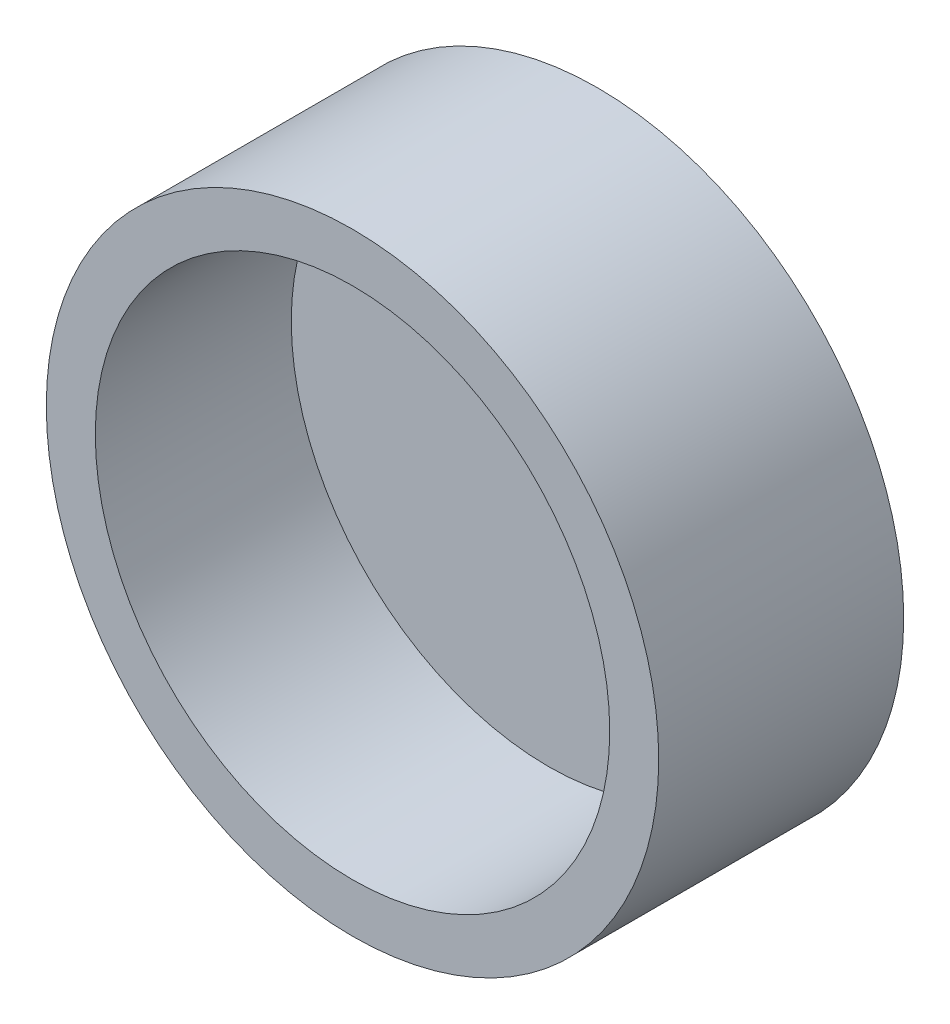
ISO-10303-21;
HEADER;
FILE_DESCRIPTION(('STEP AP214'),'2;1');
FILE_NAME('part.step','',(''),(''),'','','');
FILE_SCHEMA(('AUTOMOTIVE_DESIGN { 1 0 10303 214 1 1 1 1 }'));
ENDSEC;
DATA;
#1=APPLICATION_CONTEXT('core data for automotive mechanical design processes');
#2=APPLICATION_PROTOCOL_DEFINITION('international standard','automotive_design',2000,#1);
#3=PRODUCT_CONTEXT('',#1,'mechanical');
#4=PRODUCT('Part','Part','',(#3));
#5=PRODUCT_RELATED_PRODUCT_CATEGORY('part','',(#4));
#6=PRODUCT_DEFINITION_FORMATION('','',#4);
#7=PRODUCT_DEFINITION_CONTEXT('part definition',#1,'design');
#8=PRODUCT_DEFINITION('design','',#6,#7);
#9=PRODUCT_DEFINITION_SHAPE('','',#8);
#10=(LENGTH_UNIT() NAMED_UNIT(*) SI_UNIT(.MILLI.,.METRE.));
#11=(NAMED_UNIT(*) PLANE_ANGLE_UNIT() SI_UNIT($,.RADIAN.));
#12=(NAMED_UNIT(*) SI_UNIT($,.STERADIAN.) SOLID_ANGLE_UNIT());
#13=UNCERTAINTY_MEASURE_WITH_UNIT(LENGTH_MEASURE(1.E-05),#10,'distance_accuracy_value','');
#14=(GEOMETRIC_REPRESENTATION_CONTEXT(3) GLOBAL_UNCERTAINTY_ASSIGNED_CONTEXT((#13)) GLOBAL_UNIT_ASSIGNED_CONTEXT((#10,
#11,#12)) REPRESENTATION_CONTEXT('',''));
#15=CARTESIAN_POINT('',(0.,0.,0.));
#16=DIRECTION('',(0.,0.,1.));
#17=DIRECTION('',(1.,0.,0.));
#18=AXIS2_PLACEMENT_3D('',#15,#16,#17);
#19=CARTESIAN_POINT('',(0.,0.,12.7));
#20=DIRECTION('',(0.,0.,-1.));
#21=DIRECTION('',(-1.,0.,0.));
#22=AXIS2_PLACEMENT_3D('',#19,#20,#21);
#23=CYLINDRICAL_SURFACE('',#22,15.875);
#24=CARTESIAN_POINT('',(0.,0.,12.7));
#25=DIRECTION('',(0.,0.,1.));
#26=DIRECTION('',(1.,0.,0.));
#27=AXIS2_PLACEMENT_3D('',#24,#25,#26);
#28=CIRCLE('',#27,15.875);
#29=CARTESIAN_POINT('',(15.875,0.,12.7));
#30=VERTEX_POINT('',#29);
#31=EDGE_CURVE('E10',#30,#30,#28,.T.);
#32=ORIENTED_EDGE('',*,*,#31,.F.);
#33=EDGE_LOOP('',(#32));
#34=FACE_BOUND('',#33,.T.);
#35=CARTESIAN_POINT('',(0.,0.,0.));
#36=DIRECTION('',(0.,0.,1.));
#37=DIRECTION('',(1.,0.,0.));
#38=AXIS2_PLACEMENT_3D('',#35,#36,#37);
#39=CIRCLE('',#38,15.875);
#40=CARTESIAN_POINT('',(15.875,0.,0.));
#41=VERTEX_POINT('',#40);
#42=EDGE_CURVE('E33',#41,#41,#39,.T.);
#43=ORIENTED_EDGE('',*,*,#42,.T.);
#44=EDGE_LOOP('',(#43));
#45=FACE_BOUND('',#44,.T.);
#46=ADVANCED_FACE('F30',(#34,#45),#23,.T.);
#47=CARTESIAN_POINT('',(0.,0.,12.7));
#48=DIRECTION('',(0.,0.,1.));
#49=DIRECTION('',(1.,0.,0.));
#50=AXIS2_PLACEMENT_3D('',#47,#48,#49);
#51=PLANE('',#50);
#52=CARTESIAN_POINT('',(0.,0.,12.7));
#53=DIRECTION('',(0.,0.,1.));
#54=DIRECTION('',(1.,0.,0.));
#55=AXIS2_PLACEMENT_3D('',#52,#53,#54);
#56=CIRCLE('',#55,13.335);
#57=CARTESIAN_POINT('',(13.335,0.,12.7));
#58=VERTEX_POINT('',#57);
#59=EDGE_CURVE('E40',#58,#58,#56,.T.);
#60=ORIENTED_EDGE('',*,*,#59,.F.);
#61=EDGE_LOOP('',(#60));
#62=FACE_BOUND('',#61,.T.);
#63=ORIENTED_EDGE('',*,*,#31,.T.);
#64=EDGE_LOOP('',(#63));
#65=FACE_BOUND('',#64,.T.);
#66=ADVANCED_FACE('F60',(#62,#65),#51,.T.);
#67=CARTESIAN_POINT('',(0.,0.,0.));
#68=DIRECTION('',(0.,0.,1.));
#69=DIRECTION('',(1.,0.,0.));
#70=AXIS2_PLACEMENT_3D('',#67,#68,#69);
#71=PLANE('',#70);
#72=ORIENTED_EDGE('',*,*,#42,.F.);
#73=EDGE_LOOP('',(#72));
#74=FACE_BOUND('',#73,.T.);
#75=ADVANCED_FACE('F52',(#74),#71,.F.);
#76=CARTESIAN_POINT('',(0.,0.,12.7));
#77=DIRECTION('',(0.,0.,-1.));
#78=DIRECTION('',(-1.,0.,0.));
#79=AXIS2_PLACEMENT_3D('',#76,#77,#78);
#80=CYLINDRICAL_SURFACE('',#79,13.335);
#81=ORIENTED_EDGE('',*,*,#59,.T.);
#82=EDGE_LOOP('',(#81));
#83=FACE_BOUND('',#82,.T.);
#84=CARTESIAN_POINT('',(0.,0.,2.54));
#85=DIRECTION('',(0.,0.,1.));
#86=DIRECTION('',(1.,0.,0.));
#87=AXIS2_PLACEMENT_3D('',#84,#85,#86);
#88=CIRCLE('',#87,13.335);
#89=CARTESIAN_POINT('',(13.335,0.,2.54));
#90=VERTEX_POINT('',#89);
#91=EDGE_CURVE('E44',#90,#90,#88,.T.);
#92=ORIENTED_EDGE('',*,*,#91,.F.);
#93=EDGE_LOOP('',(#92));
#94=FACE_BOUND('',#93,.T.);
#95=ADVANCED_FACE('F50',(#83,#94),#80,.F.);
#96=CARTESIAN_POINT('',(0.,0.,2.54));
#97=DIRECTION('',(0.,0.,1.));
#98=DIRECTION('',(1.,0.,0.));
#99=AXIS2_PLACEMENT_3D('',#96,#97,#98);
#100=PLANE('',#99);
#101=ORIENTED_EDGE('',*,*,#91,.T.);
#102=EDGE_LOOP('',(#101));
#103=FACE_BOUND('',#102,.T.);
#104=ADVANCED_FACE('F48',(#103),#100,.T.);
#105=CLOSED_SHELL('',(#46,#66,#75,#95,#104));
#106=MANIFOLD_SOLID_BREP('B2',#105);
#107=ADVANCED_BREP_SHAPE_REPRESENTATION('',(#18,#106),#14);
#108=SHAPE_DEFINITION_REPRESENTATION(#9,#107);
ENDSEC;
END-ISO-10303-21;
